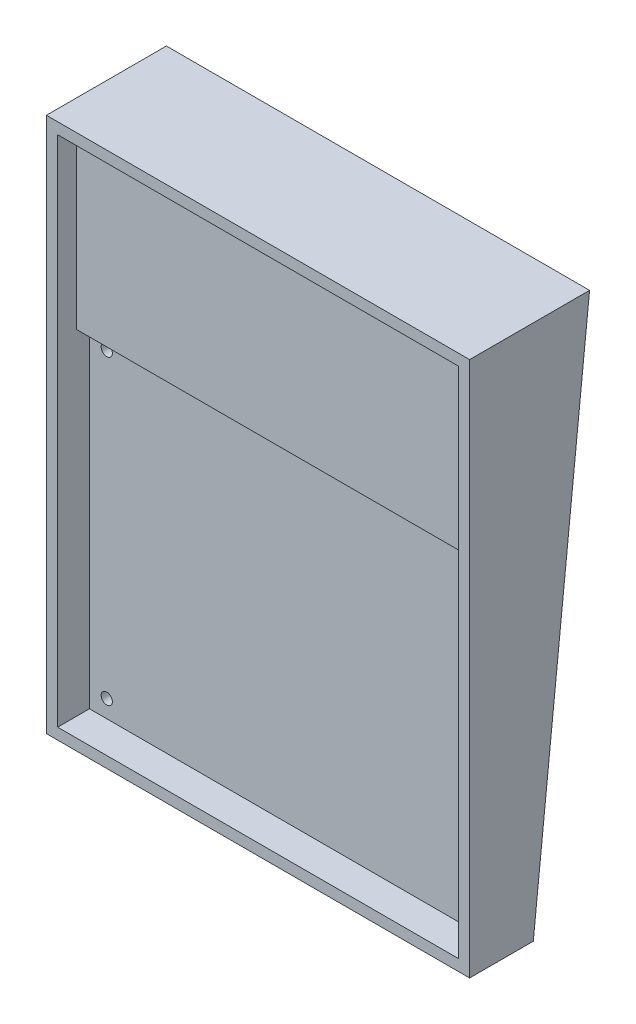
ISO-10303-21;
HEADER;
FILE_DESCRIPTION(('STEP AP214'),'2;1');
FILE_NAME('part.step','',(''),(''),'','','');
FILE_SCHEMA(('AUTOMOTIVE_DESIGN { 1 0 10303 214 1 1 1 1 }'));
ENDSEC;
DATA;
#1=APPLICATION_CONTEXT('core data for automotive mechanical design processes');
#2=APPLICATION_PROTOCOL_DEFINITION('international standard','automotive_design',2000,#1);
#3=PRODUCT_CONTEXT('',#1,'mechanical');
#4=PRODUCT('Part','Part','',(#3));
#5=PRODUCT_RELATED_PRODUCT_CATEGORY('part','',(#4));
#6=PRODUCT_DEFINITION_FORMATION('','',#4);
#7=PRODUCT_DEFINITION_CONTEXT('part definition',#1,'design');
#8=PRODUCT_DEFINITION('design','',#6,#7);
#9=PRODUCT_DEFINITION_SHAPE('','',#8);
#10=(LENGTH_UNIT() NAMED_UNIT(*) SI_UNIT(.MILLI.,.METRE.));
#11=(NAMED_UNIT(*) PLANE_ANGLE_UNIT() SI_UNIT($,.RADIAN.));
#12=(NAMED_UNIT(*) SI_UNIT($,.STERADIAN.) SOLID_ANGLE_UNIT());
#13=UNCERTAINTY_MEASURE_WITH_UNIT(LENGTH_MEASURE(1.E-05),#10,'distance_accuracy_value','');
#14=(GEOMETRIC_REPRESENTATION_CONTEXT(3) GLOBAL_UNCERTAINTY_ASSIGNED_CONTEXT((#13)) GLOBAL_UNIT_ASSIGNED_CONTEXT((#10,
#11,#12)) REPRESENTATION_CONTEXT('',''));
#15=CARTESIAN_POINT('',(0.,0.,0.));
#16=DIRECTION('',(0.,0.,1.));
#17=DIRECTION('',(1.,0.,0.));
#18=AXIS2_PLACEMENT_3D('',#15,#16,#17);
#19=CARTESIAN_POINT('',(-1.,136.,9.5));
#20=DIRECTION('',(1.,0.,0.));
#21=DIRECTION('',(0.,1.,0.));
#22=AXIS2_PLACEMENT_3D('',#19,#20,#21);
#23=PLANE('',#22);
#24=DIRECTION('',(0.,-1.,0.));
#25=VECTOR('',#24,1.);
#26=CARTESIAN_POINT('',(-1.,136.,1.));
#27=LINE('',#26,#25);
#28=CARTESIAN_POINT('',(-0.999999999999994,88.49,1.));
#29=VERTEX_POINT('',#28);
#30=CARTESIAN_POINT('',(-0.999999999999983,-1.,1.));
#31=VERTEX_POINT('',#30);
#32=EDGE_CURVE('E200',#29,#31,#27,.T.);
#33=ORIENTED_EDGE('',*,*,#32,.F.);
#34=DIRECTION('',(0.,0.,-1.));
#35=VECTOR('',#34,1.);
#36=CARTESIAN_POINT('',(-0.999999999999994,88.49,4.5));
#37=LINE('',#36,#35);
#38=CARTESIAN_POINT('',(-0.999999999999994,88.49,4.5));
#39=VERTEX_POINT('',#38);
#40=EDGE_CURVE('E57',#39,#29,#37,.T.);
#41=ORIENTED_EDGE('',*,*,#40,.F.);
#42=DIRECTION('',(0.,-1.,0.));
#43=VECTOR('',#42,1.);
#44=CARTESIAN_POINT('',(-1.,136.,4.5));
#45=LINE('',#44,#43);
#46=CARTESIAN_POINT('',(-1.,136.,4.5));
#47=VERTEX_POINT('',#46);
#48=EDGE_CURVE('E146',#47,#39,#45,.T.);
#49=ORIENTED_EDGE('',*,*,#48,.F.);
#50=DIRECTION('',(0.,0.,-1.));
#51=VECTOR('',#50,1.);
#52=CARTESIAN_POINT('',(-1.,136.,9.5));
#53=LINE('',#52,#51);
#54=CARTESIAN_POINT('',(-1.,136.,9.5));
#55=VERTEX_POINT('',#54);
#56=EDGE_CURVE('E199',#55,#47,#53,.T.);
#57=ORIENTED_EDGE('',*,*,#56,.F.);
#58=DIRECTION('',(0.,-1.,0.));
#59=VECTOR('',#58,1.);
#60=CARTESIAN_POINT('',(-1.,136.,9.5));
#61=LINE('',#60,#59);
#62=CARTESIAN_POINT('',(-0.999999999999983,-1.,9.5));
#63=VERTEX_POINT('',#62);
#64=EDGE_CURVE('E185',#55,#63,#61,.T.);
#65=ORIENTED_EDGE('',*,*,#64,.T.);
#66=DIRECTION('',(0.,0.,-1.));
#67=VECTOR('',#66,1.);
#68=CARTESIAN_POINT('',(-0.999999999999983,-1.,9.5));
#69=LINE('',#68,#67);
#70=EDGE_CURVE('E218',#63,#31,#69,.T.);
#71=ORIENTED_EDGE('',*,*,#70,.T.);
#72=EDGE_LOOP('',(#33,#41,#49,#57,#65,#71));
#73=FACE_BOUND('',#72,.T.);
#74=ADVANCED_FACE('F39',(#73),#23,.T.);
#75=CARTESIAN_POINT('',(106.,136.,9.5));
#76=DIRECTION('',(-1.,0.,0.));
#77=DIRECTION('',(0.,-1.,0.));
#78=AXIS2_PLACEMENT_3D('',#75,#76,#77);
#79=PLANE('',#78);
#80=DIRECTION('',(0.,1.,0.));
#81=VECTOR('',#80,1.);
#82=CARTESIAN_POINT('',(106.,136.,4.5));
#83=LINE('',#82,#81);
#84=CARTESIAN_POINT('',(106.,88.49,4.5));
#85=VERTEX_POINT('',#84);
#86=CARTESIAN_POINT('',(106.,136.,4.5));
#87=VERTEX_POINT('',#86);
#88=EDGE_CURVE('E65',#85,#87,#83,.T.);
#89=ORIENTED_EDGE('',*,*,#88,.F.);
#90=DIRECTION('',(0.,0.,-1.));
#91=VECTOR('',#90,1.);
#92=CARTESIAN_POINT('',(106.,88.49,4.5));
#93=LINE('',#92,#91);
#94=CARTESIAN_POINT('',(106.,88.49,1.));
#95=VERTEX_POINT('',#94);
#96=EDGE_CURVE('E160',#85,#95,#93,.T.);
#97=ORIENTED_EDGE('',*,*,#96,.T.);
#98=DIRECTION('',(0.,1.,0.));
#99=VECTOR('',#98,1.);
#100=CARTESIAN_POINT('',(106.,136.,1.));
#101=LINE('',#100,#99);
#102=CARTESIAN_POINT('',(106.,-1.,1.));
#103=VERTEX_POINT('',#102);
#104=EDGE_CURVE('E189',#103,#95,#101,.T.);
#105=ORIENTED_EDGE('',*,*,#104,.F.);
#106=DIRECTION('',(0.,0.,-1.));
#107=VECTOR('',#106,1.);
#108=CARTESIAN_POINT('',(106.,-1.,9.5));
#109=LINE('',#108,#107);
#110=CARTESIAN_POINT('',(106.,-1.,9.5));
#111=VERTEX_POINT('',#110);
#112=EDGE_CURVE('E215',#111,#103,#109,.T.);
#113=ORIENTED_EDGE('',*,*,#112,.F.);
#114=DIRECTION('',(0.,1.,0.));
#115=VECTOR('',#114,1.);
#116=CARTESIAN_POINT('',(106.,136.,9.5));
#117=LINE('',#116,#115);
#118=CARTESIAN_POINT('',(106.,136.,9.5));
#119=VERTEX_POINT('',#118);
#120=EDGE_CURVE('E192',#111,#119,#117,.T.);
#121=ORIENTED_EDGE('',*,*,#120,.T.);
#122=DIRECTION('',(0.,0.,-1.));
#123=VECTOR('',#122,1.);
#124=CARTESIAN_POINT('',(106.,136.,9.5));
#125=LINE('',#124,#123);
#126=EDGE_CURVE('E212',#119,#87,#125,.T.);
#127=ORIENTED_EDGE('',*,*,#126,.T.);
#128=EDGE_LOOP('',(#89,#97,#105,#113,#121,#127));
#129=FACE_BOUND('',#128,.T.);
#130=ADVANCED_FACE('F281',(#129),#79,.T.);
#131=CARTESIAN_POINT('',(0.,0.,1.));
#132=DIRECTION('',(0.,0.,-1.));
#133=DIRECTION('',(-1.,0.,0.));
#134=AXIS2_PLACEMENT_3D('',#131,#132,#133);
#135=PLANE('',#134);
#136=CARTESIAN_POINT('',(3.61,84.24,1.));
#137=DIRECTION('',(0.,0.,-1.));
#138=DIRECTION('',(-1.,0.,0.));
#139=AXIS2_PLACEMENT_3D('',#136,#137,#138);
#140=CIRCLE('',#139,1.5);
#141=CARTESIAN_POINT('',(2.11,84.24,1.));
#142=VERTEX_POINT('',#141);
#143=EDGE_CURVE('E184',#142,#142,#140,.T.);
#144=ORIENTED_EDGE('',*,*,#143,.T.);
#145=EDGE_LOOP('',(#144));
#146=FACE_BOUND('',#145,.T.);
#147=CARTESIAN_POINT('',(101.26,3.67999999999998,1.));
#148=DIRECTION('',(0.,0.,-1.));
#149=DIRECTION('',(-1.,0.,0.));
#150=AXIS2_PLACEMENT_3D('',#147,#148,#149);
#151=CIRCLE('',#150,1.5);
#152=CARTESIAN_POINT('',(99.76,3.67999999999998,1.));
#153=VERTEX_POINT('',#152);
#154=EDGE_CURVE('E248',#153,#153,#151,.T.);
#155=ORIENTED_EDGE('',*,*,#154,.T.);
#156=EDGE_LOOP('',(#155));
#157=FACE_BOUND('',#156,.T.);
#158=CARTESIAN_POINT('',(3.61,3.67999999999998,1.));
#159=DIRECTION('',(0.,0.,-1.));
#160=DIRECTION('',(-1.,0.,0.));
#161=AXIS2_PLACEMENT_3D('',#158,#159,#160);
#162=CIRCLE('',#161,1.5);
#163=CARTESIAN_POINT('',(2.11,3.67999999999998,1.));
#164=VERTEX_POINT('',#163);
#165=EDGE_CURVE('E251',#164,#164,#162,.T.);
#166=ORIENTED_EDGE('',*,*,#165,.T.);
#167=EDGE_LOOP('',(#166));
#168=FACE_BOUND('',#167,.T.);
#169=CARTESIAN_POINT('',(101.26,84.24,1.));
#170=DIRECTION('',(0.,0.,-1.));
#171=DIRECTION('',(-1.,0.,0.));
#172=AXIS2_PLACEMENT_3D('',#169,#170,#171);
#173=CIRCLE('',#172,1.5);
#174=CARTESIAN_POINT('',(99.76,84.24,1.));
#175=VERTEX_POINT('',#174);
#176=EDGE_CURVE('E43',#175,#175,#173,.T.);
#177=ORIENTED_EDGE('',*,*,#176,.T.);
#178=EDGE_LOOP('',(#177));
#179=FACE_BOUND('',#178,.T.);
#180=DIRECTION('',(1.,0.,0.));
#181=VECTOR('',#180,1.);
#182=CARTESIAN_POINT('',(-0.999999999999994,88.49,1.));
#183=LINE('',#182,#181);
#184=EDGE_CURVE('E151',#29,#95,#183,.T.);
#185=ORIENTED_EDGE('',*,*,#184,.F.);
#186=ORIENTED_EDGE('',*,*,#32,.T.);
#187=DIRECTION('',(1.,0.,0.));
#188=VECTOR('',#187,1.);
#189=CARTESIAN_POINT('',(-0.999999999999983,-1.,1.));
#190=LINE('',#189,#188);
#191=EDGE_CURVE('E203',#31,#103,#190,.T.);
#192=ORIENTED_EDGE('',*,*,#191,.T.);
#193=ORIENTED_EDGE('',*,*,#104,.T.);
#194=EDGE_LOOP('',(#185,#186,#192,#193));
#195=FACE_BOUND('',#194,.T.);
#196=ADVANCED_FACE('F41',(#146,#157,#168,#179,#195),#135,.F.);
#197=CARTESIAN_POINT('',(-4.,139.,-7.5));
#198=DIRECTION('',(-1.,0.,0.));
#199=DIRECTION('',(0.,-1.,0.));
#200=AXIS2_PLACEMENT_3D('',#197,#198,#199);
#201=PLANE('',#200);
#202=DIRECTION('',(0.,0.,1.));
#203=VECTOR('',#202,1.);
#204=CARTESIAN_POINT('',(-3.99999999999998,-4.,-7.5));
#205=LINE('',#204,#203);
#206=CARTESIAN_POINT('',(-3.99999999999998,-4.,-7.5));
#207=VERTEX_POINT('',#206);
#208=CARTESIAN_POINT('',(-3.99999999999998,-4.,9.5));
#209=VERTEX_POINT('',#208);
#210=EDGE_CURVE('E236',#207,#209,#205,.T.);
#211=ORIENTED_EDGE('',*,*,#210,.T.);
#212=DIRECTION('',(0.,-1.,0.));
#213=VECTOR('',#212,1.);
#214=CARTESIAN_POINT('',(-4.,139.,9.5));
#215=LINE('',#214,#213);
#216=CARTESIAN_POINT('',(-4.,139.,9.5));
#217=VERTEX_POINT('',#216);
#218=EDGE_CURVE('E127',#217,#209,#215,.T.);
#219=ORIENTED_EDGE('',*,*,#218,.F.);
#220=DIRECTION('',(0.,0.,1.));
#221=VECTOR('',#220,1.);
#222=CARTESIAN_POINT('',(-4.,139.,-7.5));
#223=LINE('',#222,#221);
#224=CARTESIAN_POINT('',(-4.,139.,-22.5299056429924));
#225=VERTEX_POINT('',#224);
#226=EDGE_CURVE('E11',#225,#217,#223,.T.);
#227=ORIENTED_EDGE('',*,*,#226,.F.);
#228=DIRECTION('',(0.,-0.994521895368273,0.104528463267658));
#229=VECTOR('',#228,1.);
#230=CARTESIAN_POINT('',(-4.,139.,-22.5299056429924));
#231=LINE('',#230,#229);
#232=EDGE_CURVE('E124',#225,#207,#231,.T.);
#233=ORIENTED_EDGE('',*,*,#232,.T.);
#234=EDGE_LOOP('',(#211,#219,#227,#233));
#235=FACE_BOUND('',#234,.T.);
#236=ADVANCED_FACE('F122',(#235),#201,.T.);
#237=CARTESIAN_POINT('',(-4.,139.,-7.5));
#238=DIRECTION('',(0.,-1.,0.));
#239=DIRECTION('',(0.,0.,-1.));
#240=AXIS2_PLACEMENT_3D('',#237,#238,#239);
#241=PLANE('',#240);
#242=ORIENTED_EDGE('',*,*,#226,.T.);
#243=DIRECTION('',(-1.,0.,0.));
#244=VECTOR('',#243,1.);
#245=CARTESIAN_POINT('',(-4.,139.,9.5));
#246=LINE('',#245,#244);
#247=CARTESIAN_POINT('',(109.,139.,9.5));
#248=VERTEX_POINT('',#247);
#249=EDGE_CURVE('E232',#248,#217,#246,.T.);
#250=ORIENTED_EDGE('',*,*,#249,.F.);
#251=DIRECTION('',(0.,0.,1.));
#252=VECTOR('',#251,1.);
#253=CARTESIAN_POINT('',(109.,139.,-7.5));
#254=LINE('',#253,#252);
#255=CARTESIAN_POINT('',(109.,139.,-22.5299056429924));
#256=VERTEX_POINT('',#255);
#257=EDGE_CURVE('E49',#256,#248,#254,.T.);
#258=ORIENTED_EDGE('',*,*,#257,.F.);
#259=DIRECTION('',(-1.,0.,0.));
#260=VECTOR('',#259,1.);
#261=CARTESIAN_POINT('',(252.787683977583,139.,-22.5299056429924));
#262=LINE('',#261,#260);
#263=EDGE_CURVE('E132',#256,#225,#262,.T.);
#264=ORIENTED_EDGE('',*,*,#263,.T.);
#265=EDGE_LOOP('',(#242,#250,#258,#264));
#266=FACE_BOUND('',#265,.T.);
#267=ADVANCED_FACE('F133',(#266),#241,.F.);
#268=CARTESIAN_POINT('',(109.,139.,-7.5));
#269=DIRECTION('',(-1.,0.,0.));
#270=DIRECTION('',(0.,-1.,0.));
#271=AXIS2_PLACEMENT_3D('',#268,#269,#270);
#272=PLANE('',#271);
#273=ORIENTED_EDGE('',*,*,#257,.T.);
#274=DIRECTION('',(0.,1.,0.));
#275=VECTOR('',#274,1.);
#276=CARTESIAN_POINT('',(109.,139.,9.5));
#277=LINE('',#276,#275);
#278=CARTESIAN_POINT('',(109.,-4.,9.5));
#279=VERTEX_POINT('',#278);
#280=EDGE_CURVE('E228',#279,#248,#277,.T.);
#281=ORIENTED_EDGE('',*,*,#280,.F.);
#282=DIRECTION('',(0.,0.,1.));
#283=VECTOR('',#282,1.);
#284=CARTESIAN_POINT('',(109.,-4.,-7.5));
#285=LINE('',#284,#283);
#286=CARTESIAN_POINT('',(109.,-4.,-7.5));
#287=VERTEX_POINT('',#286);
#288=EDGE_CURVE('E240',#287,#279,#285,.T.);
#289=ORIENTED_EDGE('',*,*,#288,.F.);
#290=DIRECTION('',(0.,0.994521895368273,-0.104528463267658));
#291=VECTOR('',#290,1.);
#292=CARTESIAN_POINT('',(109.,139.,-22.5299056429924));
#293=LINE('',#292,#291);
#294=EDGE_CURVE('E137',#287,#256,#293,.T.);
#295=ORIENTED_EDGE('',*,*,#294,.T.);
#296=EDGE_LOOP('',(#273,#281,#289,#295));
#297=FACE_BOUND('',#296,.T.);
#298=ADVANCED_FACE('F297',(#297),#272,.F.);
#299=CARTESIAN_POINT('',(-3.99999999999998,-4.,-7.5));
#300=DIRECTION('',(0.,-1.,0.));
#301=DIRECTION('',(0.,0.,-1.));
#302=AXIS2_PLACEMENT_3D('',#299,#300,#301);
#303=PLANE('',#302);
#304=ORIENTED_EDGE('',*,*,#288,.T.);
#305=DIRECTION('',(1.,0.,0.));
#306=VECTOR('',#305,1.);
#307=CARTESIAN_POINT('',(-3.99999999999998,-4.,9.5));
#308=LINE('',#307,#306);
#309=EDGE_CURVE('E224',#209,#279,#308,.T.);
#310=ORIENTED_EDGE('',*,*,#309,.F.);
#311=ORIENTED_EDGE('',*,*,#210,.F.);
#312=DIRECTION('',(1.,0.,0.));
#313=VECTOR('',#312,1.);
#314=CARTESIAN_POINT('',(-3.99999999999998,-4.,-7.5));
#315=LINE('',#314,#313);
#316=EDGE_CURVE('E141',#207,#287,#315,.T.);
#317=ORIENTED_EDGE('',*,*,#316,.T.);
#318=EDGE_LOOP('',(#304,#310,#311,#317));
#319=FACE_BOUND('',#318,.T.);
#320=ADVANCED_FACE('F293',(#319),#303,.T.);
#321=CARTESIAN_POINT('',(0.,0.,9.5));
#322=DIRECTION('',(0.,0.,1.));
#323=DIRECTION('',(1.,0.,0.));
#324=AXIS2_PLACEMENT_3D('',#321,#322,#323);
#325=PLANE('',#324);
#326=ORIENTED_EDGE('',*,*,#218,.T.);
#327=ORIENTED_EDGE('',*,*,#309,.T.);
#328=ORIENTED_EDGE('',*,*,#280,.T.);
#329=ORIENTED_EDGE('',*,*,#249,.T.);
#330=EDGE_LOOP('',(#326,#327,#328,#329));
#331=FACE_BOUND('',#330,.T.);
#332=DIRECTION('',(1.,0.,0.));
#333=VECTOR('',#332,1.);
#334=CARTESIAN_POINT('',(-0.999999999999983,-1.,9.5));
#335=LINE('',#334,#333);
#336=EDGE_CURVE('E188',#63,#111,#335,.T.);
#337=ORIENTED_EDGE('',*,*,#336,.F.);
#338=ORIENTED_EDGE('',*,*,#64,.F.);
#339=DIRECTION('',(-1.,0.,0.));
#340=VECTOR('',#339,1.);
#341=CARTESIAN_POINT('',(-1.,136.,9.5));
#342=LINE('',#341,#340);
#343=EDGE_CURVE('E196',#119,#55,#342,.T.);
#344=ORIENTED_EDGE('',*,*,#343,.F.);
#345=ORIENTED_EDGE('',*,*,#120,.F.);
#346=EDGE_LOOP('',(#337,#338,#344,#345));
#347=FACE_BOUND('',#346,.T.);
#348=ADVANCED_FACE('F290',(#331,#347),#325,.T.);
#349=CARTESIAN_POINT('',(-0.999999999999983,-1.,9.5));
#350=DIRECTION('',(0.,1.,0.));
#351=DIRECTION('',(0.,0.,1.));
#352=AXIS2_PLACEMENT_3D('',#349,#350,#351);
#353=PLANE('',#352);
#354=ORIENTED_EDGE('',*,*,#191,.F.);
#355=ORIENTED_EDGE('',*,*,#70,.F.);
#356=ORIENTED_EDGE('',*,*,#336,.T.);
#357=ORIENTED_EDGE('',*,*,#112,.T.);
#358=EDGE_LOOP('',(#354,#355,#356,#357));
#359=FACE_BOUND('',#358,.T.);
#360=ADVANCED_FACE('F289',(#359),#353,.T.);
#361=CARTESIAN_POINT('',(-1.,136.,9.5));
#362=DIRECTION('',(0.,-1.,0.));
#363=DIRECTION('',(0.,0.,-1.));
#364=AXIS2_PLACEMENT_3D('',#361,#362,#363);
#365=PLANE('',#364);
#366=DIRECTION('',(-1.,0.,0.));
#367=VECTOR('',#366,1.);
#368=CARTESIAN_POINT('',(-1.,136.,4.5));
#369=LINE('',#368,#367);
#370=EDGE_CURVE('E156',#87,#47,#369,.T.);
#371=ORIENTED_EDGE('',*,*,#370,.F.);
#372=ORIENTED_EDGE('',*,*,#126,.F.);
#373=ORIENTED_EDGE('',*,*,#343,.T.);
#374=ORIENTED_EDGE('',*,*,#56,.T.);
#375=EDGE_LOOP('',(#371,#372,#373,#374));
#376=FACE_BOUND('',#375,.T.);
#377=ADVANCED_FACE('F376',(#376),#365,.T.);
#378=CARTESIAN_POINT('',(3.61,84.24,-5.));
#379=DIRECTION('',(0.,0.,1.));
#380=DIRECTION('',(1.,0.,0.));
#381=AXIS2_PLACEMENT_3D('',#378,#379,#380);
#382=CYLINDRICAL_SURFACE('',#381,1.5);
#383=CARTESIAN_POINT('',(3.61,84.24,-5.));
#384=DIRECTION('',(0.,0.,1.));
#385=DIRECTION('',(1.,0.,0.));
#386=AXIS2_PLACEMENT_3D('',#383,#384,#385);
#387=CIRCLE('',#386,1.5);
#388=CARTESIAN_POINT('',(5.11,84.24,-5.));
#389=VERTEX_POINT('',#388);
#390=EDGE_CURVE('E177',#389,#389,#387,.T.);
#391=ORIENTED_EDGE('',*,*,#390,.F.);
#392=EDGE_LOOP('',(#391));
#393=FACE_BOUND('',#392,.T.);
#394=ORIENTED_EDGE('',*,*,#143,.F.);
#395=EDGE_LOOP('',(#394));
#396=FACE_BOUND('',#395,.T.);
#397=ADVANCED_FACE('F325',(#393,#396),#382,.F.);
#398=CARTESIAN_POINT('',(3.61,84.24,-5.));
#399=DIRECTION('',(0.,0.,1.));
#400=DIRECTION('',(1.,0.,0.));
#401=AXIS2_PLACEMENT_3D('',#398,#399,#400);
#402=PLANE('',#401);
#403=ORIENTED_EDGE('',*,*,#390,.T.);
#404=EDGE_LOOP('',(#403));
#405=FACE_BOUND('',#404,.T.);
#406=ADVANCED_FACE('F317',(#405),#402,.T.);
#407=CARTESIAN_POINT('',(101.26,3.67999999999998,-5.));
#408=DIRECTION('',(0.,0.,1.));
#409=DIRECTION('',(1.,0.,0.));
#410=AXIS2_PLACEMENT_3D('',#407,#408,#409);
#411=CYLINDRICAL_SURFACE('',#410,1.5);
#412=CARTESIAN_POINT('',(101.26,3.67999999999998,-5.));
#413=DIRECTION('',(0.,0.,1.));
#414=DIRECTION('',(1.,0.,0.));
#415=AXIS2_PLACEMENT_3D('',#412,#413,#414);
#416=CIRCLE('',#415,1.5);
#417=CARTESIAN_POINT('',(102.76,3.67999999999998,-5.));
#418=VERTEX_POINT('',#417);
#419=EDGE_CURVE('E168',#418,#418,#416,.T.);
#420=ORIENTED_EDGE('',*,*,#419,.F.);
#421=EDGE_LOOP('',(#420));
#422=FACE_BOUND('',#421,.T.);
#423=ORIENTED_EDGE('',*,*,#154,.F.);
#424=EDGE_LOOP('',(#423));
#425=FACE_BOUND('',#424,.T.);
#426=ADVANCED_FACE('F314',(#422,#425),#411,.F.);
#427=CARTESIAN_POINT('',(101.26,3.67999999999998,-5.));
#428=DIRECTION('',(0.,0.,1.));
#429=DIRECTION('',(1.,0.,0.));
#430=AXIS2_PLACEMENT_3D('',#427,#428,#429);
#431=PLANE('',#430);
#432=ORIENTED_EDGE('',*,*,#419,.T.);
#433=EDGE_LOOP('',(#432));
#434=FACE_BOUND('',#433,.T.);
#435=ADVANCED_FACE('F316',(#434),#431,.T.);
#436=CARTESIAN_POINT('',(3.61,3.67999999999998,-5.));
#437=DIRECTION('',(0.,0.,1.));
#438=DIRECTION('',(1.,0.,0.));
#439=AXIS2_PLACEMENT_3D('',#436,#437,#438);
#440=CYLINDRICAL_SURFACE('',#439,1.5);
#441=CARTESIAN_POINT('',(3.61,3.67999999999998,-5.));
#442=DIRECTION('',(0.,0.,1.));
#443=DIRECTION('',(1.,0.,0.));
#444=AXIS2_PLACEMENT_3D('',#441,#442,#443);
#445=CIRCLE('',#444,1.5);
#446=CARTESIAN_POINT('',(5.11,3.67999999999998,-5.));
#447=VERTEX_POINT('',#446);
#448=EDGE_CURVE('E172',#447,#447,#445,.T.);
#449=ORIENTED_EDGE('',*,*,#448,.F.);
#450=EDGE_LOOP('',(#449));
#451=FACE_BOUND('',#450,.T.);
#452=ORIENTED_EDGE('',*,*,#165,.F.);
#453=EDGE_LOOP('',(#452));
#454=FACE_BOUND('',#453,.T.);
#455=ADVANCED_FACE('F275',(#451,#454),#440,.F.);
#456=CARTESIAN_POINT('',(3.61,3.67999999999998,-5.));
#457=DIRECTION('',(0.,0.,1.));
#458=DIRECTION('',(1.,0.,0.));
#459=AXIS2_PLACEMENT_3D('',#456,#457,#458);
#460=PLANE('',#459);
#461=ORIENTED_EDGE('',*,*,#448,.T.);
#462=EDGE_LOOP('',(#461));
#463=FACE_BOUND('',#462,.T.);
#464=ADVANCED_FACE('F265',(#463),#460,.T.);
#465=CARTESIAN_POINT('',(101.26,84.24,-5.));
#466=DIRECTION('',(0.,0.,1.));
#467=DIRECTION('',(1.,0.,0.));
#468=AXIS2_PLACEMENT_3D('',#465,#466,#467);
#469=CYLINDRICAL_SURFACE('',#468,1.5);
#470=CARTESIAN_POINT('',(101.26,84.24,-5.));
#471=DIRECTION('',(0.,0.,1.));
#472=DIRECTION('',(1.,0.,0.));
#473=AXIS2_PLACEMENT_3D('',#470,#471,#472);
#474=CIRCLE('',#473,1.5);
#475=CARTESIAN_POINT('',(102.76,84.24,-5.));
#476=VERTEX_POINT('',#475);
#477=EDGE_CURVE('E173',#476,#476,#474,.T.);
#478=ORIENTED_EDGE('',*,*,#477,.F.);
#479=EDGE_LOOP('',(#478));
#480=FACE_BOUND('',#479,.T.);
#481=ORIENTED_EDGE('',*,*,#176,.F.);
#482=EDGE_LOOP('',(#481));
#483=FACE_BOUND('',#482,.T.);
#484=ADVANCED_FACE('F262',(#480,#483),#469,.F.);
#485=CARTESIAN_POINT('',(101.26,84.24,-5.));
#486=DIRECTION('',(0.,0.,1.));
#487=DIRECTION('',(1.,0.,0.));
#488=AXIS2_PLACEMENT_3D('',#485,#486,#487);
#489=PLANE('',#488);
#490=ORIENTED_EDGE('',*,*,#477,.T.);
#491=EDGE_LOOP('',(#490));
#492=FACE_BOUND('',#491,.T.);
#493=ADVANCED_FACE('F264',(#492),#489,.T.);
#494=CARTESIAN_POINT('',(-0.999999999999994,88.49,4.5));
#495=DIRECTION('',(0.,1.,0.));
#496=DIRECTION('',(0.,0.,1.));
#497=AXIS2_PLACEMENT_3D('',#494,#495,#496);
#498=PLANE('',#497);
#499=ORIENTED_EDGE('',*,*,#184,.T.);
#500=ORIENTED_EDGE('',*,*,#96,.F.);
#501=DIRECTION('',(1.,0.,0.));
#502=VECTOR('',#501,1.);
#503=CARTESIAN_POINT('',(-0.999999999999994,88.49,4.5));
#504=LINE('',#503,#502);
#505=EDGE_CURVE('E150',#39,#85,#504,.T.);
#506=ORIENTED_EDGE('',*,*,#505,.F.);
#507=ORIENTED_EDGE('',*,*,#40,.T.);
#508=EDGE_LOOP('',(#499,#500,#506,#507));
#509=FACE_BOUND('',#508,.T.);
#510=ADVANCED_FACE('F272',(#509),#498,.F.);
#511=CARTESIAN_POINT('',(0.,0.,4.5));
#512=DIRECTION('',(0.,0.,1.));
#513=DIRECTION('',(1.,0.,0.));
#514=AXIS2_PLACEMENT_3D('',#511,#512,#513);
#515=PLANE('',#514);
#516=ORIENTED_EDGE('',*,*,#48,.T.);
#517=ORIENTED_EDGE('',*,*,#505,.T.);
#518=ORIENTED_EDGE('',*,*,#88,.T.);
#519=ORIENTED_EDGE('',*,*,#370,.T.);
#520=EDGE_LOOP('',(#516,#517,#518,#519));
#521=FACE_BOUND('',#520,.T.);
#522=ADVANCED_FACE('F332',(#521),#515,.T.);
#523=CARTESIAN_POINT('',(252.787683977583,139.,-22.5299056429924));
#524=DIRECTION('',(0.,-0.104528463267658,-0.994521895368273));
#525=DIRECTION('',(0.,0.994521895368273,-0.104528463267658));
#526=AXIS2_PLACEMENT_3D('',#523,#524,#525);
#527=PLANE('',#526);
#528=ORIENTED_EDGE('',*,*,#294,.F.);
#529=ORIENTED_EDGE('',*,*,#316,.F.);
#530=ORIENTED_EDGE('',*,*,#232,.F.);
#531=ORIENTED_EDGE('',*,*,#263,.F.);
#532=EDGE_LOOP('',(#528,#529,#530,#531));
#533=FACE_BOUND('',#532,.T.);
#534=ADVANCED_FACE('F139',(#533),#527,.T.);
#535=CLOSED_SHELL('',(#74,#130,#196,#236,#267,#298,#320,#348,#360,#377,#397,#406,#426,#435,#455,
#464,#484,#493,#510,#522,#534));
#536=MANIFOLD_SOLID_BREP('B2',#535);
#537=ADVANCED_BREP_SHAPE_REPRESENTATION('',(#18,#536),#14);
#538=SHAPE_DEFINITION_REPRESENTATION(#9,#537);
ENDSEC;
END-ISO-10303-21;
